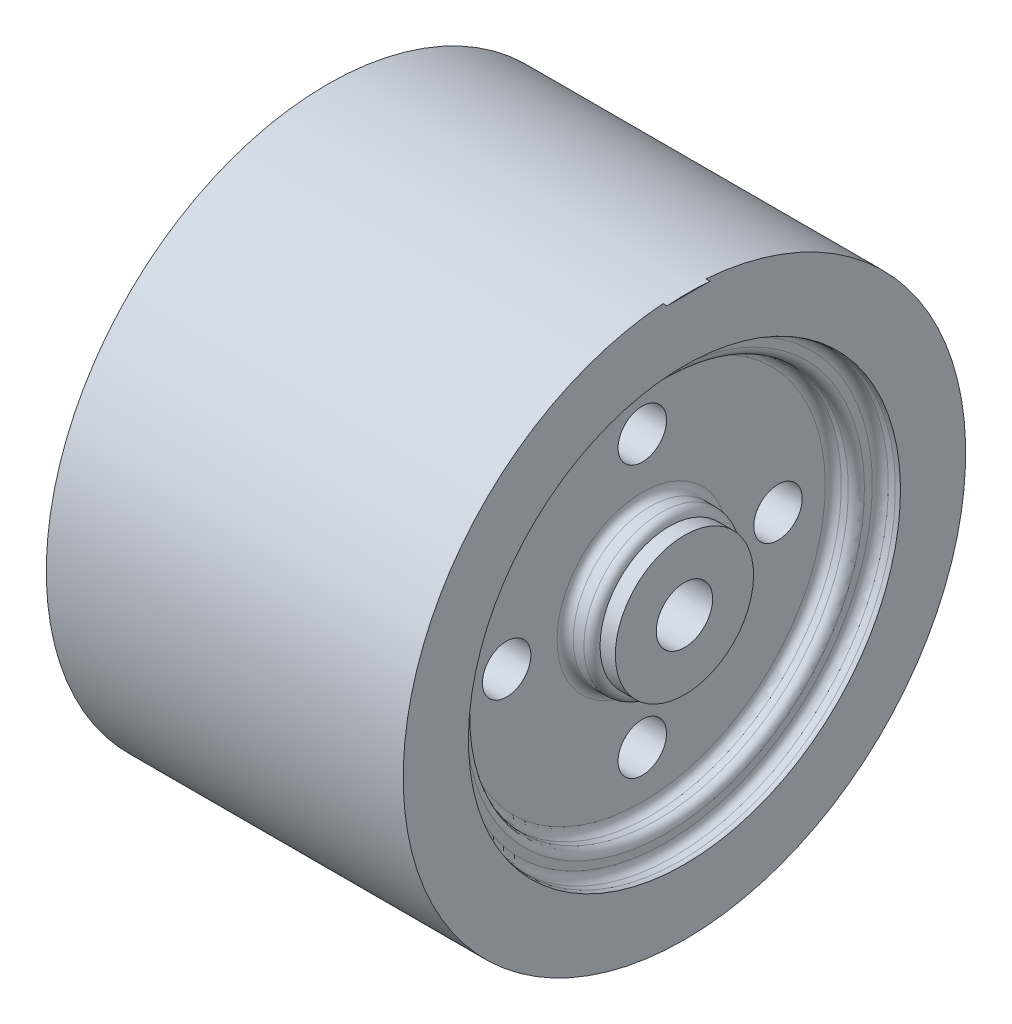
ISO-10303-21;
HEADER;
FILE_DESCRIPTION(('STEP AP214'),'2;1');
FILE_NAME('part.step','',(''),(''),'','','');
FILE_SCHEMA(('AUTOMOTIVE_DESIGN { 1 0 10303 214 1 1 1 1 }'));
ENDSEC;
DATA;
#1=APPLICATION_CONTEXT('core data for automotive mechanical design processes');
#2=APPLICATION_PROTOCOL_DEFINITION('international standard','automotive_design',2000,#1);
#3=PRODUCT_CONTEXT('',#1,'mechanical');
#4=PRODUCT('Part','Part','',(#3));
#5=PRODUCT_RELATED_PRODUCT_CATEGORY('part','',(#4));
#6=PRODUCT_DEFINITION_FORMATION('','',#4);
#7=PRODUCT_DEFINITION_CONTEXT('part definition',#1,'design');
#8=PRODUCT_DEFINITION('design','',#6,#7);
#9=PRODUCT_DEFINITION_SHAPE('','',#8);
#10=(LENGTH_UNIT() NAMED_UNIT(*) SI_UNIT(.MILLI.,.METRE.));
#11=(NAMED_UNIT(*) PLANE_ANGLE_UNIT() SI_UNIT($,.RADIAN.));
#12=(NAMED_UNIT(*) SI_UNIT($,.STERADIAN.) SOLID_ANGLE_UNIT());
#13=UNCERTAINTY_MEASURE_WITH_UNIT(LENGTH_MEASURE(1.E-05),#10,'distance_accuracy_value','');
#14=(GEOMETRIC_REPRESENTATION_CONTEXT(3) GLOBAL_UNCERTAINTY_ASSIGNED_CONTEXT((#13)) GLOBAL_UNIT_ASSIGNED_CONTEXT((#10,
#11,#12)) REPRESENTATION_CONTEXT('',''));
#15=CARTESIAN_POINT('',(0.,0.,0.));
#16=DIRECTION('',(0.,0.,1.));
#17=DIRECTION('',(1.,0.,0.));
#18=AXIS2_PLACEMENT_3D('',#15,#16,#17);
#19=CARTESIAN_POINT('',(24.,34.0850434994007,0.));
#20=DIRECTION('',(-1.,0.,0.));
#21=DIRECTION('',(0.,-1.,0.));
#22=AXIS2_PLACEMENT_3D('',#19,#20,#21);
#23=CYLINDRICAL_SURFACE('',#22,8.57905084931098);
#24=CARTESIAN_POINT('',(-20.,34.0850434994007,0.));
#25=DIRECTION('',(-1.,0.,0.));
#26=DIRECTION('',(0.,-1.,0.));
#27=AXIS2_PLACEMENT_3D('',#24,#25,#26);
#28=CIRCLE('',#27,8.57905084931098);
#29=CARTESIAN_POINT('',(-20.,25.5059926500898,0.));
#30=VERTEX_POINT('',#29);
#31=EDGE_CURVE('E43',#30,#30,#28,.T.);
#32=ORIENTED_EDGE('',*,*,#31,.T.);
#33=EDGE_LOOP('',(#32));
#34=FACE_BOUND('',#33,.T.);
#35=CARTESIAN_POINT('',(-22.,34.0850434994007,0.));
#36=DIRECTION('',(1.,0.,0.));
#37=DIRECTION('',(0.,1.,0.));
#38=AXIS2_PLACEMENT_3D('',#35,#36,#37);
#39=CIRCLE('',#38,8.57905084931098);
#40=CARTESIAN_POINT('',(-22.,42.6640943487117,0.));
#41=VERTEX_POINT('',#40);
#42=EDGE_CURVE('E11',#41,#41,#39,.T.);
#43=ORIENTED_EDGE('',*,*,#42,.T.);
#44=EDGE_LOOP('',(#43));
#45=FACE_BOUND('',#44,.T.);
#46=ADVANCED_FACE('F34',(#34,#45),#23,.T.);
#47=CARTESIAN_POINT('',(20.,34.0850434994007,0.));
#48=DIRECTION('',(1.,0.,0.));
#49=DIRECTION('',(0.,1.,0.));
#50=AXIS2_PLACEMENT_3D('',#47,#48,#49);
#51=CIRCLE('',#50,8.57905084931098);
#52=CARTESIAN_POINT('',(20.,42.6640943487117,0.));
#53=VERTEX_POINT('',#52);
#54=EDGE_CURVE('E503',#53,#53,#51,.F.);
#55=ORIENTED_EDGE('',*,*,#54,.F.);
#56=EDGE_LOOP('',(#55));
#57=FACE_BOUND('',#56,.T.);
#58=CARTESIAN_POINT('',(21.9,34.0850434994007,0.));
#59=DIRECTION('',(1.,0.,0.));
#60=DIRECTION('',(0.,1.,0.));
#61=AXIS2_PLACEMENT_3D('',#58,#59,#60);
#62=CIRCLE('',#61,8.57905084931098);
#63=CARTESIAN_POINT('',(21.9,42.6640943487117,0.));
#64=VERTEX_POINT('',#63);
#65=EDGE_CURVE('E74',#64,#64,#62,.T.);
#66=ORIENTED_EDGE('',*,*,#65,.F.);
#67=EDGE_LOOP('',(#66));
#68=FACE_BOUND('',#67,.T.);
#69=ADVANCED_FACE('F139',(#57,#68),#23,.T.);
#70=CARTESIAN_POINT('',(-45.3449936196497,34.0850434994007,0.));
#71=DIRECTION('',(-1.,0.,0.));
#72=DIRECTION('',(0.,-1.,0.));
#73=AXIS2_PLACEMENT_3D('',#70,#71,#72);
#74=CYLINDRICAL_SURFACE('',#73,3.50000000000001);
#75=CARTESIAN_POINT('',(-22.,34.0850434994007,0.));
#76=DIRECTION('',(1.,0.,0.));
#77=DIRECTION('',(0.,1.,0.));
#78=AXIS2_PLACEMENT_3D('',#75,#76,#77);
#79=CIRCLE('',#78,3.50000000000001);
#80=CARTESIAN_POINT('',(-22.,37.5850434994007,0.));
#81=VERTEX_POINT('',#80);
#82=EDGE_CURVE('E500',#81,#81,#79,.T.);
#83=ORIENTED_EDGE('',*,*,#82,.F.);
#84=EDGE_LOOP('',(#83));
#85=FACE_BOUND('',#84,.T.);
#86=CARTESIAN_POINT('',(21.9,34.0850434994007,0.));
#87=DIRECTION('',(1.,0.,0.));
#88=DIRECTION('',(0.,1.,0.));
#89=AXIS2_PLACEMENT_3D('',#86,#87,#88);
#90=CIRCLE('',#89,3.50000000000001);
#91=CARTESIAN_POINT('',(21.9,37.5850434994008,0.));
#92=VERTEX_POINT('',#91);
#93=EDGE_CURVE('E491',#92,#92,#90,.T.);
#94=ORIENTED_EDGE('',*,*,#93,.T.);
#95=EDGE_LOOP('',(#94));
#96=FACE_BOUND('',#95,.T.);
#97=ADVANCED_FACE('F135',(#85,#96),#74,.F.);
#98=CARTESIAN_POINT('',(21.4,34.0850434994007,0.));
#99=DIRECTION('',(-1.,0.,0.));
#100=DIRECTION('',(0.,-1.,0.));
#101=AXIS2_PLACEMENT_3D('',#98,#99,#100);
#102=TOROIDAL_SURFACE('',#101,27.6818695266668,1.);
#103=CARTESIAN_POINT('',(21.4,34.0850434994007,0.));
#104=DIRECTION('',(-1.,0.,0.));
#105=DIRECTION('',(0.,-1.,0.));
#106=AXIS2_PLACEMENT_3D('',#103,#104,#105);
#107=CIRCLE('',#106,26.6818695266668);
#108=CARTESIAN_POINT('',(21.4,7.40317397273399,0.));
#109=VERTEX_POINT('',#108);
#110=EDGE_CURVE('E78',#109,#109,#107,.T.);
#111=ORIENTED_EDGE('',*,*,#110,.T.);
#112=EDGE_LOOP('',(#111));
#113=FACE_BOUND('',#112,.T.);
#114=CARTESIAN_POINT('',(21.9,34.0850434994007,0.));
#115=DIRECTION('',(-1.,0.,0.));
#116=DIRECTION('',(0.,-1.,0.));
#117=AXIS2_PLACEMENT_3D('',#114,#115,#116);
#118=CIRCLE('',#117,26.8158441228823);
#119=CARTESIAN_POINT('',(21.9,7.26919937651843,0.));
#120=VERTEX_POINT('',#119);
#121=EDGE_CURVE('E38',#120,#120,#118,.F.);
#122=ORIENTED_EDGE('',*,*,#121,.T.);
#123=EDGE_LOOP('',(#122));
#124=FACE_BOUND('',#123,.T.);
#125=ADVANCED_FACE('F127',(#113,#124),#102,.T.);
#126=CARTESIAN_POINT('',(-19.,34.0850434994007,0.));
#127=DIRECTION('',(-1.,0.,0.));
#128=DIRECTION('',(0.,-1.,0.));
#129=AXIS2_PLACEMENT_3D('',#126,#127,#128);
#130=TOROIDAL_SURFACE('',#129,8.57905084931098,0.999999999999997);
#131=CARTESIAN_POINT('',(-19.,34.0850434994007,0.));
#132=DIRECTION('',(-1.,0.,0.));
#133=DIRECTION('',(0.,-1.,0.));
#134=AXIS2_PLACEMENT_3D('',#131,#132,#133);
#135=CIRCLE('',#134,9.57905084931097);
#136=CARTESIAN_POINT('',(-19.,24.5059926500898,0.));
#137=VERTEX_POINT('',#136);
#138=EDGE_CURVE('E117',#137,#137,#135,.T.);
#139=ORIENTED_EDGE('',*,*,#138,.T.);
#140=EDGE_LOOP('',(#139));
#141=FACE_BOUND('',#140,.T.);
#142=ORIENTED_EDGE('',*,*,#31,.F.);
#143=EDGE_LOOP('',(#142));
#144=FACE_BOUND('',#143,.T.);
#145=ADVANCED_FACE('F36',(#141,#144),#130,.T.);
#146=CARTESIAN_POINT('',(-45.3449936196497,34.0850434994007,0.));
#147=DIRECTION('',(-1.,0.,0.));
#148=DIRECTION('',(0.,-1.,0.));
#149=AXIS2_PLACEMENT_3D('',#146,#147,#148);
#150=CYLINDRICAL_SURFACE('',#149,9.57905084931097);
#151=CARTESIAN_POINT('',(-17.6686422910207,34.0850434994007,0.));
#152=DIRECTION('',(-1.,0.,0.));
#153=DIRECTION('',(0.,-1.,0.));
#154=AXIS2_PLACEMENT_3D('',#151,#152,#153);
#155=CIRCLE('',#154,9.57905084931097);
#156=CARTESIAN_POINT('',(-17.6686422910207,24.5059926500898,0.));
#157=VERTEX_POINT('',#156);
#158=EDGE_CURVE('E114',#157,#157,#155,.T.);
#159=ORIENTED_EDGE('',*,*,#158,.T.);
#160=EDGE_LOOP('',(#159));
#161=FACE_BOUND('',#160,.T.);
#162=ORIENTED_EDGE('',*,*,#138,.F.);
#163=EDGE_LOOP('',(#162));
#164=FACE_BOUND('',#163,.T.);
#165=ADVANCED_FACE('F126',(#161,#164),#150,.T.);
#166=CARTESIAN_POINT('',(-17.6686422910207,34.0850434994007,0.));
#167=DIRECTION('',(-1.,0.,0.));
#168=DIRECTION('',(0.,-1.,0.));
#169=AXIS2_PLACEMENT_3D('',#166,#167,#168);
#170=TOROIDAL_SURFACE('',#169,10.579050849311,1.);
#171=CARTESIAN_POINT('',(-16.6686422910207,34.0850434994007,0.));
#172=DIRECTION('',(-1.,0.,0.));
#173=DIRECTION('',(0.,-1.,0.));
#174=AXIS2_PLACEMENT_3D('',#171,#172,#173);
#175=CIRCLE('',#174,10.579050849311);
#176=CARTESIAN_POINT('',(-16.6686422910207,23.5059926500898,0.));
#177=VERTEX_POINT('',#176);
#178=EDGE_CURVE('E111',#177,#177,#175,.T.);
#179=ORIENTED_EDGE('',*,*,#178,.T.);
#180=EDGE_LOOP('',(#179));
#181=FACE_BOUND('',#180,.T.);
#182=ORIENTED_EDGE('',*,*,#158,.F.);
#183=EDGE_LOOP('',(#182));
#184=FACE_BOUND('',#183,.T.);
#185=ADVANCED_FACE('F133',(#181,#184),#170,.F.);
#186=CARTESIAN_POINT('',(-16.6686422910207,23.5059926500898,0.));
#187=DIRECTION('',(-1.,0.,0.));
#188=DIRECTION('',(0.,-1.,0.));
#189=AXIS2_PLACEMENT_3D('',#186,#187,#188);
#190=PLANE('',#189);
#191=CARTESIAN_POINT('',(-16.6686422910207,50.9244513745696,0.));
#192=DIRECTION('',(-1.,0.,0.));
#193=DIRECTION('',(0.,-1.,0.));
#194=AXIS2_PLACEMENT_3D('',#191,#192,#193);
#195=CIRCLE('',#194,3.00725892953214);
#196=CARTESIAN_POINT('',(-16.6686422910207,47.9171924450375,0.));
#197=VERTEX_POINT('',#196);
#198=EDGE_CURVE('E527',#197,#197,#195,.T.);
#199=ORIENTED_EDGE('',*,*,#198,.F.);
#200=EDGE_LOOP('',(#199));
#201=FACE_BOUND('',#200,.T.);
#202=CARTESIAN_POINT('',(-16.6686422910207,34.0850434994009,-16.8394078751691));
#203=DIRECTION('',(-1.,0.,0.));
#204=DIRECTION('',(0.,-1.,0.));
#205=AXIS2_PLACEMENT_3D('',#202,#203,#204);
#206=CIRCLE('',#205,3.00725892953214);
#207=CARTESIAN_POINT('',(-16.6686422910207,31.0777845698688,-16.8394078751691));
#208=VERTEX_POINT('',#207);
#209=EDGE_CURVE('E524',#208,#208,#206,.T.);
#210=ORIENTED_EDGE('',*,*,#209,.F.);
#211=EDGE_LOOP('',(#210));
#212=FACE_BOUND('',#211,.T.);
#213=CARTESIAN_POINT('',(-16.6686422910207,17.2456356242319,-3.52766870119921E-13));
#214=DIRECTION('',(-1.,0.,0.));
#215=DIRECTION('',(0.,-1.,0.));
#216=AXIS2_PLACEMENT_3D('',#213,#214,#215);
#217=CIRCLE('',#216,3.00725892953214);
#218=CARTESIAN_POINT('',(-16.6686422910207,14.2383766946997,-3.52766870119921E-13));
#219=VERTEX_POINT('',#218);
#220=EDGE_CURVE('E521',#219,#219,#217,.T.);
#221=ORIENTED_EDGE('',*,*,#220,.F.);
#222=EDGE_LOOP('',(#221));
#223=FACE_BOUND('',#222,.T.);
#224=CARTESIAN_POINT('',(-16.6686422910207,34.0850434994007,16.8394078751686));
#225=DIRECTION('',(-1.,0.,0.));
#226=DIRECTION('',(0.,-1.,0.));
#227=AXIS2_PLACEMENT_3D('',#224,#225,#226);
#228=CIRCLE('',#227,3.00725892953214);
#229=CARTESIAN_POINT('',(-16.6686422910207,31.0777845698685,16.8394078751686));
#230=VERTEX_POINT('',#229);
#231=EDGE_CURVE('E510',#230,#230,#228,.T.);
#232=ORIENTED_EDGE('',*,*,#231,.F.);
#233=EDGE_LOOP('',(#232));
#234=FACE_BOUND('',#233,.T.);
#235=CARTESIAN_POINT('',(-16.6686422910207,34.0850434994007,0.));
#236=DIRECTION('',(-1.,0.,0.));
#237=DIRECTION('',(0.,-1.,0.));
#238=AXIS2_PLACEMENT_3D('',#235,#236,#237);
#239=CIRCLE('',#238,22.7098120973116);
#240=CARTESIAN_POINT('',(-16.6686422910207,11.3752314020891,0.));
#241=VERTEX_POINT('',#240);
#242=EDGE_CURVE('E108',#241,#241,#239,.T.);
#243=ORIENTED_EDGE('',*,*,#242,.T.);
#244=EDGE_LOOP('',(#243));
#245=FACE_BOUND('',#244,.T.);
#246=ORIENTED_EDGE('',*,*,#178,.F.);
#247=EDGE_LOOP('',(#246));
#248=FACE_BOUND('',#247,.T.);
#249=ADVANCED_FACE('F243',(#201,#212,#223,#234,#245,#248),#190,.T.);
#250=CARTESIAN_POINT('',(-17.6686422910207,34.0850434994007,0.));
#251=DIRECTION('',(-1.,0.,0.));
#252=DIRECTION('',(0.,-1.,0.));
#253=AXIS2_PLACEMENT_3D('',#250,#251,#252);
#254=TOROIDAL_SURFACE('',#253,22.7098120973116,0.999999999999996);
#255=CARTESIAN_POINT('',(-17.6686422910207,34.0850434994007,0.));
#256=DIRECTION('',(-1.,0.,0.));
#257=DIRECTION('',(0.,-1.,0.));
#258=AXIS2_PLACEMENT_3D('',#255,#256,#257);
#259=CIRCLE('',#258,23.7098120973116);
#260=CARTESIAN_POINT('',(-17.6686422910207,10.3752314020891,0.));
#261=VERTEX_POINT('',#260);
#262=EDGE_CURVE('E105',#261,#261,#259,.T.);
#263=ORIENTED_EDGE('',*,*,#262,.T.);
#264=EDGE_LOOP('',(#263));
#265=FACE_BOUND('',#264,.T.);
#266=ORIENTED_EDGE('',*,*,#242,.F.);
#267=EDGE_LOOP('',(#266));
#268=FACE_BOUND('',#267,.T.);
#269=ADVANCED_FACE('F239',(#265,#268),#254,.F.);
#270=CARTESIAN_POINT('',(-45.3449936196497,34.0850434994007,0.));
#271=DIRECTION('',(-1.,0.,0.));
#272=DIRECTION('',(0.,-1.,0.));
#273=AXIS2_PLACEMENT_3D('',#270,#271,#272);
#274=CYLINDRICAL_SURFACE('',#273,23.7098120973116);
#275=CARTESIAN_POINT('',(-18.5343211455104,34.0850434994007,0.));
#276=DIRECTION('',(-1.,0.,0.));
#277=DIRECTION('',(0.,-1.,0.));
#278=AXIS2_PLACEMENT_3D('',#275,#276,#277);
#279=CIRCLE('',#278,23.7098120973116);
#280=CARTESIAN_POINT('',(-18.5343211455103,10.3752314020891,0.));
#281=VERTEX_POINT('',#280);
#282=EDGE_CURVE('E102',#281,#281,#279,.T.);
#283=ORIENTED_EDGE('',*,*,#282,.T.);
#284=EDGE_LOOP('',(#283));
#285=FACE_BOUND('',#284,.T.);
#286=ORIENTED_EDGE('',*,*,#262,.F.);
#287=EDGE_LOOP('',(#286));
#288=FACE_BOUND('',#287,.T.);
#289=ADVANCED_FACE('F235',(#285,#288),#274,.F.);
#290=CARTESIAN_POINT('',(-18.5343211455104,34.0850434994007,0.));
#291=DIRECTION('',(-1.,0.,0.));
#292=DIRECTION('',(0.,-1.,0.));
#293=AXIS2_PLACEMENT_3D('',#290,#291,#292);
#294=TOROIDAL_SURFACE('',#293,24.7098120973116,1.);
#295=CARTESIAN_POINT('',(-19.5343211455104,34.0850434994007,0.));
#296=DIRECTION('',(-1.,0.,0.));
#297=DIRECTION('',(0.,-1.,0.));
#298=AXIS2_PLACEMENT_3D('',#295,#296,#297);
#299=CIRCLE('',#298,24.7098120973116);
#300=CARTESIAN_POINT('',(-19.5343211455103,9.37523140208914,0.));
#301=VERTEX_POINT('',#300);
#302=EDGE_CURVE('E99',#301,#301,#299,.T.);
#303=ORIENTED_EDGE('',*,*,#302,.T.);
#304=EDGE_LOOP('',(#303));
#305=FACE_BOUND('',#304,.T.);
#306=ORIENTED_EDGE('',*,*,#282,.F.);
#307=EDGE_LOOP('',(#306));
#308=FACE_BOUND('',#307,.T.);
#309=ADVANCED_FACE('F231',(#305,#308),#294,.T.);
#310=CARTESIAN_POINT('',(-19.5343211455103,8.40317397273399,0.));
#311=DIRECTION('',(-1.,0.,0.));
#312=DIRECTION('',(0.,-1.,0.));
#313=AXIS2_PLACEMENT_3D('',#310,#311,#312);
#314=PLANE('',#313);
#315=CARTESIAN_POINT('',(-19.5343211455104,34.0850434994007,0.));
#316=DIRECTION('',(-1.,0.,0.));
#317=DIRECTION('',(0.,-1.,0.));
#318=AXIS2_PLACEMENT_3D('',#315,#316,#317);
#319=CIRCLE('',#318,25.6818695266668);
#320=CARTESIAN_POINT('',(-19.5343211455103,8.40317397273399,0.));
#321=VERTEX_POINT('',#320);
#322=EDGE_CURVE('E96',#321,#321,#319,.T.);
#323=ORIENTED_EDGE('',*,*,#322,.T.);
#324=EDGE_LOOP('',(#323));
#325=FACE_BOUND('',#324,.T.);
#326=ORIENTED_EDGE('',*,*,#302,.F.);
#327=EDGE_LOOP('',(#326));
#328=FACE_BOUND('',#327,.T.);
#329=ADVANCED_FACE('F227',(#325,#328),#314,.T.);
#330=CARTESIAN_POINT('',(-20.5343211455104,34.0850434994007,0.));
#331=DIRECTION('',(-1.,0.,0.));
#332=DIRECTION('',(0.,-1.,0.));
#333=AXIS2_PLACEMENT_3D('',#330,#331,#332);
#334=TOROIDAL_SURFACE('',#333,25.6818695266668,1.);
#335=CARTESIAN_POINT('',(-20.5343211455104,34.0850434994007,0.));
#336=DIRECTION('',(-1.,0.,0.));
#337=DIRECTION('',(0.,-1.,0.));
#338=AXIS2_PLACEMENT_3D('',#335,#336,#337);
#339=CIRCLE('',#338,26.6818695266668);
#340=CARTESIAN_POINT('',(-20.5343211455103,7.40317397273399,0.));
#341=VERTEX_POINT('',#340);
#342=EDGE_CURVE('E93',#341,#341,#339,.T.);
#343=ORIENTED_EDGE('',*,*,#342,.T.);
#344=EDGE_LOOP('',(#343));
#345=FACE_BOUND('',#344,.T.);
#346=ORIENTED_EDGE('',*,*,#322,.F.);
#347=EDGE_LOOP('',(#346));
#348=FACE_BOUND('',#347,.T.);
#349=ADVANCED_FACE('F223',(#345,#348),#334,.F.);
#350=CARTESIAN_POINT('',(-45.3449936196497,34.0850434994007,0.));
#351=DIRECTION('',(-1.,0.,0.));
#352=DIRECTION('',(0.,-1.,0.));
#353=AXIS2_PLACEMENT_3D('',#350,#351,#352);
#354=CYLINDRICAL_SURFACE('',#353,26.6818695266667);
#355=CARTESIAN_POINT('',(-21.4,34.0850434994007,0.));
#356=DIRECTION('',(-1.,0.,0.));
#357=DIRECTION('',(0.,-1.,0.));
#358=AXIS2_PLACEMENT_3D('',#355,#356,#357);
#359=CIRCLE('',#358,26.6818695266667);
#360=CARTESIAN_POINT('',(-21.4,7.40317397273399,0.));
#361=VERTEX_POINT('',#360);
#362=EDGE_CURVE('E90',#361,#361,#359,.T.);
#363=ORIENTED_EDGE('',*,*,#362,.T.);
#364=EDGE_LOOP('',(#363));
#365=FACE_BOUND('',#364,.T.);
#366=ORIENTED_EDGE('',*,*,#342,.F.);
#367=EDGE_LOOP('',(#366));
#368=FACE_BOUND('',#367,.T.);
#369=ADVANCED_FACE('F219',(#365,#368),#354,.F.);
#370=CARTESIAN_POINT('',(-21.4,34.0850434994007,0.));
#371=DIRECTION('',(-1.,0.,0.));
#372=DIRECTION('',(0.,-1.,0.));
#373=AXIS2_PLACEMENT_3D('',#370,#371,#372);
#374=TOROIDAL_SURFACE('',#373,27.6818695266667,1.);
#375=CARTESIAN_POINT('',(-22.4,34.0850434994007,0.));
#376=DIRECTION('',(-1.,0.,0.));
#377=DIRECTION('',(0.,-1.,0.));
#378=AXIS2_PLACEMENT_3D('',#375,#376,#377);
#379=CIRCLE('',#378,27.6818695266667);
#380=CARTESIAN_POINT('',(-22.4,6.40317397273399,0.));
#381=VERTEX_POINT('',#380);
#382=EDGE_CURVE('E81',#381,#381,#379,.T.);
#383=ORIENTED_EDGE('',*,*,#382,.T.);
#384=EDGE_LOOP('',(#383));
#385=FACE_BOUND('',#384,.T.);
#386=ORIENTED_EDGE('',*,*,#362,.F.);
#387=EDGE_LOOP('',(#386));
#388=FACE_BOUND('',#387,.T.);
#389=ADVANCED_FACE('F215',(#385,#388),#374,.T.);
#390=CARTESIAN_POINT('',(-22.4,6.40317397273399,0.));
#391=DIRECTION('',(-1.,0.,0.));
#392=DIRECTION('',(0.,-1.,0.));
#393=AXIS2_PLACEMENT_3D('',#390,#391,#392);
#394=PLANE('',#393);
#395=CARTESIAN_POINT('',(-22.4,34.0850434994007,0.));
#396=DIRECTION('',(-1.,0.,0.));
#397=DIRECTION('',(0.,-1.,0.));
#398=AXIS2_PLACEMENT_3D('',#395,#396,#397);
#399=CIRCLE('',#398,34.9074128176976);
#400=CARTESIAN_POINT('',(-22.4,-0.822369318296837,0.));
#401=VERTEX_POINT('',#400);
#402=EDGE_CURVE('E77',#401,#401,#399,.T.);
#403=ORIENTED_EDGE('',*,*,#402,.T.);
#404=EDGE_LOOP('',(#403));
#405=FACE_BOUND('',#404,.T.);
#406=ORIENTED_EDGE('',*,*,#382,.F.);
#407=EDGE_LOOP('',(#406));
#408=FACE_BOUND('',#407,.T.);
#409=ADVANCED_FACE('F212',(#405,#408),#394,.T.);
#410=CARTESIAN_POINT('',(-45.3449936196497,34.0850434994007,0.));
#411=DIRECTION('',(-1.,0.,0.));
#412=DIRECTION('',(0.,-1.,0.));
#413=AXIS2_PLACEMENT_3D('',#410,#411,#412);
#414=CYLINDRICAL_SURFACE('',#413,34.9074128176976);
#415=DIRECTION('',(-1.,0.,0.));
#416=VECTOR('',#415,1.);
#417=CARTESIAN_POINT('',(-45.3449936196498,68.8917860292091,-2.64917800247341));
#418=LINE('',#417,#416);
#419=CARTESIAN_POINT('',(21.9,68.8917860292091,-2.64917800247349));
#420=VERTEX_POINT('',#419);
#421=CARTESIAN_POINT('',(22.4,68.8917860292091,-2.64917800247341));
#422=VERTEX_POINT('',#421);
#423=EDGE_CURVE('E50',#420,#422,#418,.F.);
#424=ORIENTED_EDGE('',*,*,#423,.F.);
#425=CARTESIAN_POINT('',(21.9,34.0850434994007,0.));
#426=DIRECTION('',(1.,0.,0.));
#427=DIRECTION('',(0.,1.,0.));
#428=AXIS2_PLACEMENT_3D('',#425,#426,#427);
#429=CIRCLE('',#428,34.9074128176976);
#430=CARTESIAN_POINT('',(21.9,68.8917860292091,2.64917800247349));
#431=VERTEX_POINT('',#430);
#432=EDGE_CURVE('E73',#420,#431,#429,.F.);
#433=ORIENTED_EDGE('',*,*,#432,.T.);
#434=DIRECTION('',(-1.,0.,0.));
#435=VECTOR('',#434,1.);
#436=CARTESIAN_POINT('',(-45.3449936196498,68.8917860292091,2.64917800247341));
#437=LINE('',#436,#435);
#438=CARTESIAN_POINT('',(22.4,68.8917860292091,2.64917800247342));
#439=VERTEX_POINT('',#438);
#440=EDGE_CURVE('E55',#439,#431,#437,.T.);
#441=ORIENTED_EDGE('',*,*,#440,.F.);
#442=CARTESIAN_POINT('',(22.4,34.0850434994007,0.));
#443=DIRECTION('',(-1.,0.,0.));
#444=DIRECTION('',(0.,-1.,0.));
#445=AXIS2_PLACEMENT_3D('',#442,#443,#444);
#446=CIRCLE('',#445,34.9074128176976);
#447=EDGE_CURVE('E72',#439,#422,#446,.T.);
#448=ORIENTED_EDGE('',*,*,#447,.T.);
#449=EDGE_LOOP('',(#424,#433,#441,#448));
#450=FACE_BOUND('',#449,.T.);
#451=ORIENTED_EDGE('',*,*,#402,.F.);
#452=EDGE_LOOP('',(#451));
#453=FACE_BOUND('',#452,.T.);
#454=ADVANCED_FACE('F70',(#450,#453),#414,.T.);
#455=CARTESIAN_POINT('',(22.4,-0.822369318296831,0.));
#456=DIRECTION('',(1.,0.,0.));
#457=DIRECTION('',(0.,1.,0.));
#458=AXIS2_PLACEMENT_3D('',#455,#456,#457);
#459=PLANE('',#458);
#460=DIRECTION('',(0.,0.,1.));
#461=VECTOR('',#460,1.);
#462=CARTESIAN_POINT('',(22.4,68.8917860292091,46.8308899491964));
#463=LINE('',#462,#461);
#464=EDGE_CURVE('E61',#422,#439,#463,.T.);
#465=ORIENTED_EDGE('',*,*,#464,.F.);
#466=ORIENTED_EDGE('',*,*,#447,.F.);
#467=EDGE_LOOP('',(#465,#466));
#468=FACE_BOUND('',#467,.T.);
#469=ADVANCED_FACE('F76',(#468),#459,.T.);
#470=CARTESIAN_POINT('',(-45.3449936196497,34.0850434994007,0.));
#471=DIRECTION('',(-1.,0.,0.));
#472=DIRECTION('',(0.,-1.,0.));
#473=AXIS2_PLACEMENT_3D('',#470,#471,#472);
#474=CYLINDRICAL_SURFACE('',#473,26.6818695266668);
#475=CARTESIAN_POINT('',(20.5343211455104,34.0850434994007,0.));
#476=DIRECTION('',(-1.,0.,0.));
#477=DIRECTION('',(0.,-1.,0.));
#478=AXIS2_PLACEMENT_3D('',#475,#476,#477);
#479=CIRCLE('',#478,26.6818695266668);
#480=CARTESIAN_POINT('',(20.5343211455104,7.40317397273399,0.));
#481=VERTEX_POINT('',#480);
#482=EDGE_CURVE('E84',#481,#481,#479,.T.);
#483=ORIENTED_EDGE('',*,*,#482,.T.);
#484=EDGE_LOOP('',(#483));
#485=FACE_BOUND('',#484,.T.);
#486=ORIENTED_EDGE('',*,*,#110,.F.);
#487=EDGE_LOOP('',(#486));
#488=FACE_BOUND('',#487,.T.);
#489=ADVANCED_FACE('F203',(#485,#488),#474,.F.);
#490=CARTESIAN_POINT('',(20.5343211455104,34.0850434994007,0.));
#491=DIRECTION('',(-1.,0.,0.));
#492=DIRECTION('',(0.,-1.,0.));
#493=AXIS2_PLACEMENT_3D('',#490,#491,#492);
#494=TOROIDAL_SURFACE('',#493,25.6818695266668,1.);
#495=CARTESIAN_POINT('',(19.5343211455103,34.0850434994007,0.));
#496=DIRECTION('',(-1.,0.,0.));
#497=DIRECTION('',(0.,-1.,0.));
#498=AXIS2_PLACEMENT_3D('',#495,#496,#497);
#499=CIRCLE('',#498,25.6818695266668);
#500=CARTESIAN_POINT('',(19.5343211455104,8.40317397273399,0.));
#501=VERTEX_POINT('',#500);
#502=EDGE_CURVE('E551',#501,#501,#499,.T.);
#503=ORIENTED_EDGE('',*,*,#502,.T.);
#504=EDGE_LOOP('',(#503));
#505=FACE_BOUND('',#504,.T.);
#506=ORIENTED_EDGE('',*,*,#482,.F.);
#507=EDGE_LOOP('',(#506));
#508=FACE_BOUND('',#507,.T.);
#509=ADVANCED_FACE('F199',(#505,#508),#494,.F.);
#510=CARTESIAN_POINT('',(19.5343211455104,8.40317397273399,0.));
#511=DIRECTION('',(1.,0.,0.));
#512=DIRECTION('',(0.,1.,0.));
#513=AXIS2_PLACEMENT_3D('',#510,#511,#512);
#514=PLANE('',#513);
#515=CARTESIAN_POINT('',(19.5343211455104,34.0850434994007,0.));
#516=DIRECTION('',(-1.,0.,0.));
#517=DIRECTION('',(0.,-1.,0.));
#518=AXIS2_PLACEMENT_3D('',#515,#516,#517);
#519=CIRCLE('',#518,24.7098120973116);
#520=CARTESIAN_POINT('',(19.5343211455104,9.37523140208915,0.));
#521=VERTEX_POINT('',#520);
#522=EDGE_CURVE('E548',#521,#521,#519,.T.);
#523=ORIENTED_EDGE('',*,*,#522,.T.);
#524=EDGE_LOOP('',(#523));
#525=FACE_BOUND('',#524,.T.);
#526=ORIENTED_EDGE('',*,*,#502,.F.);
#527=EDGE_LOOP('',(#526));
#528=FACE_BOUND('',#527,.T.);
#529=ADVANCED_FACE('F195',(#525,#528),#514,.T.);
#530=CARTESIAN_POINT('',(18.5343211455104,34.0850434994007,0.));
#531=DIRECTION('',(-1.,0.,0.));
#532=DIRECTION('',(0.,-1.,0.));
#533=AXIS2_PLACEMENT_3D('',#530,#531,#532);
#534=TOROIDAL_SURFACE('',#533,24.7098120973116,1.);
#535=CARTESIAN_POINT('',(18.5343211455104,34.0850434994007,0.));
#536=DIRECTION('',(-1.,0.,0.));
#537=DIRECTION('',(0.,-1.,0.));
#538=AXIS2_PLACEMENT_3D('',#535,#536,#537);
#539=CIRCLE('',#538,23.7098120973116);
#540=CARTESIAN_POINT('',(18.5343211455104,10.3752314020891,0.));
#541=VERTEX_POINT('',#540);
#542=EDGE_CURVE('E545',#541,#541,#539,.T.);
#543=ORIENTED_EDGE('',*,*,#542,.T.);
#544=EDGE_LOOP('',(#543));
#545=FACE_BOUND('',#544,.T.);
#546=ORIENTED_EDGE('',*,*,#522,.F.);
#547=EDGE_LOOP('',(#546));
#548=FACE_BOUND('',#547,.T.);
#549=ADVANCED_FACE('F191',(#545,#548),#534,.T.);
#550=CARTESIAN_POINT('',(-45.3449936196497,34.0850434994007,0.));
#551=DIRECTION('',(-1.,0.,0.));
#552=DIRECTION('',(0.,-1.,0.));
#553=AXIS2_PLACEMENT_3D('',#550,#551,#552);
#554=CYLINDRICAL_SURFACE('',#553,23.7098120973116);
#555=CARTESIAN_POINT('',(17.6686422910207,34.0850434994007,0.));
#556=DIRECTION('',(-1.,0.,0.));
#557=DIRECTION('',(0.,-1.,0.));
#558=AXIS2_PLACEMENT_3D('',#555,#556,#557);
#559=CIRCLE('',#558,23.7098120973116);
#560=CARTESIAN_POINT('',(17.6686422910207,10.3752314020892,0.));
#561=VERTEX_POINT('',#560);
#562=EDGE_CURVE('E542',#561,#561,#559,.T.);
#563=ORIENTED_EDGE('',*,*,#562,.T.);
#564=EDGE_LOOP('',(#563));
#565=FACE_BOUND('',#564,.T.);
#566=ORIENTED_EDGE('',*,*,#542,.F.);
#567=EDGE_LOOP('',(#566));
#568=FACE_BOUND('',#567,.T.);
#569=ADVANCED_FACE('F187',(#565,#568),#554,.F.);
#570=CARTESIAN_POINT('',(17.6686422910207,34.0850434994007,0.));
#571=DIRECTION('',(-1.,0.,0.));
#572=DIRECTION('',(0.,-1.,0.));
#573=AXIS2_PLACEMENT_3D('',#570,#571,#572);
#574=TOROIDAL_SURFACE('',#573,22.7098120973116,0.999999999999996);
#575=CARTESIAN_POINT('',(16.6686422910207,34.0850434994007,0.));
#576=DIRECTION('',(-1.,0.,0.));
#577=DIRECTION('',(0.,-1.,0.));
#578=AXIS2_PLACEMENT_3D('',#575,#576,#577);
#579=CIRCLE('',#578,22.7098120973116);
#580=CARTESIAN_POINT('',(16.6686422910207,11.3752314020891,0.));
#581=VERTEX_POINT('',#580);
#582=EDGE_CURVE('E539',#581,#581,#579,.T.);
#583=ORIENTED_EDGE('',*,*,#582,.T.);
#584=EDGE_LOOP('',(#583));
#585=FACE_BOUND('',#584,.T.);
#586=ORIENTED_EDGE('',*,*,#562,.F.);
#587=EDGE_LOOP('',(#586));
#588=FACE_BOUND('',#587,.T.);
#589=ADVANCED_FACE('F183',(#585,#588),#574,.F.);
#590=CARTESIAN_POINT('',(16.6686422910207,23.5059926500898,0.));
#591=DIRECTION('',(1.,0.,0.));
#592=DIRECTION('',(0.,1.,0.));
#593=AXIS2_PLACEMENT_3D('',#590,#591,#592);
#594=PLANE('',#593);
#595=CARTESIAN_POINT('',(16.6686422910207,50.9244513745696,0.));
#596=DIRECTION('',(1.,0.,0.));
#597=DIRECTION('',(0.,1.,0.));
#598=AXIS2_PLACEMENT_3D('',#595,#596,#597);
#599=CIRCLE('',#598,3.00725892953214);
#600=CARTESIAN_POINT('',(16.6686422910207,53.9317103041017,0.));
#601=VERTEX_POINT('',#600);
#602=EDGE_CURVE('E507',#601,#601,#599,.T.);
#603=ORIENTED_EDGE('',*,*,#602,.F.);
#604=EDGE_LOOP('',(#603));
#605=FACE_BOUND('',#604,.T.);
#606=CARTESIAN_POINT('',(16.6686422910207,34.0850434994009,-16.8394078751691));
#607=DIRECTION('',(1.,0.,0.));
#608=DIRECTION('',(0.,1.,0.));
#609=AXIS2_PLACEMENT_3D('',#606,#607,#608);
#610=CIRCLE('',#609,3.00725892953214);
#611=CARTESIAN_POINT('',(16.6686422910207,37.0923024289331,-16.8394078751691));
#612=VERTEX_POINT('',#611);
#613=EDGE_CURVE('E511',#612,#612,#610,.T.);
#614=ORIENTED_EDGE('',*,*,#613,.F.);
#615=EDGE_LOOP('',(#614));
#616=FACE_BOUND('',#615,.T.);
#617=CARTESIAN_POINT('',(16.6686422910207,17.2456356242319,-3.52766870119921E-13));
#618=DIRECTION('',(1.,0.,0.));
#619=DIRECTION('',(0.,1.,0.));
#620=AXIS2_PLACEMENT_3D('',#617,#618,#619);
#621=CIRCLE('',#620,3.00725892953214);
#622=CARTESIAN_POINT('',(16.6686422910207,20.252894553764,-3.52766870119921E-13));
#623=VERTEX_POINT('',#622);
#624=EDGE_CURVE('E514',#623,#623,#621,.T.);
#625=ORIENTED_EDGE('',*,*,#624,.F.);
#626=EDGE_LOOP('',(#625));
#627=FACE_BOUND('',#626,.T.);
#628=CARTESIAN_POINT('',(16.6686422910207,34.0850434994007,16.8394078751686));
#629=DIRECTION('',(1.,0.,0.));
#630=DIRECTION('',(0.,1.,0.));
#631=AXIS2_PLACEMENT_3D('',#628,#629,#630);
#632=CIRCLE('',#631,3.00725892953214);
#633=CARTESIAN_POINT('',(16.6686422910207,37.0923024289328,16.8394078751686));
#634=VERTEX_POINT('',#633);
#635=EDGE_CURVE('E506',#634,#634,#632,.T.);
#636=ORIENTED_EDGE('',*,*,#635,.F.);
#637=EDGE_LOOP('',(#636));
#638=FACE_BOUND('',#637,.T.);
#639=CARTESIAN_POINT('',(16.6686422910207,34.0850434994007,0.));
#640=DIRECTION('',(-1.,0.,0.));
#641=DIRECTION('',(0.,-1.,0.));
#642=AXIS2_PLACEMENT_3D('',#639,#640,#641);
#643=CIRCLE('',#642,10.579050849311);
#644=CARTESIAN_POINT('',(16.6686422910207,23.5059926500898,0.));
#645=VERTEX_POINT('',#644);
#646=EDGE_CURVE('E536',#645,#645,#643,.T.);
#647=ORIENTED_EDGE('',*,*,#646,.T.);
#648=EDGE_LOOP('',(#647));
#649=FACE_BOUND('',#648,.T.);
#650=ORIENTED_EDGE('',*,*,#582,.F.);
#651=EDGE_LOOP('',(#650));
#652=FACE_BOUND('',#651,.T.);
#653=ADVANCED_FACE('F179',(#605,#616,#627,#638,#649,#652),#594,.T.);
#654=CARTESIAN_POINT('',(17.6686422910207,34.0850434994007,0.));
#655=DIRECTION('',(-1.,0.,0.));
#656=DIRECTION('',(0.,-1.,0.));
#657=AXIS2_PLACEMENT_3D('',#654,#655,#656);
#658=TOROIDAL_SURFACE('',#657,10.579050849311,1.);
#659=CARTESIAN_POINT('',(17.6686422910207,34.0850434994007,0.));
#660=DIRECTION('',(-1.,0.,0.));
#661=DIRECTION('',(0.,-1.,0.));
#662=AXIS2_PLACEMENT_3D('',#659,#660,#661);
#663=CIRCLE('',#662,9.57905084931098);
#664=CARTESIAN_POINT('',(17.6686422910207,24.5059926500898,0.));
#665=VERTEX_POINT('',#664);
#666=EDGE_CURVE('E533',#665,#665,#663,.T.);
#667=ORIENTED_EDGE('',*,*,#666,.T.);
#668=EDGE_LOOP('',(#667));
#669=FACE_BOUND('',#668,.T.);
#670=ORIENTED_EDGE('',*,*,#646,.F.);
#671=EDGE_LOOP('',(#670));
#672=FACE_BOUND('',#671,.T.);
#673=ADVANCED_FACE('F175',(#669,#672),#658,.F.);
#674=CARTESIAN_POINT('',(-45.3449936196497,34.0850434994007,0.));
#675=DIRECTION('',(-1.,0.,0.));
#676=DIRECTION('',(0.,-1.,0.));
#677=AXIS2_PLACEMENT_3D('',#674,#675,#676);
#678=CYLINDRICAL_SURFACE('',#677,9.57905084931098);
#679=CARTESIAN_POINT('',(19.,34.0850434994007,0.));
#680=DIRECTION('',(-1.,0.,0.));
#681=DIRECTION('',(0.,-1.,0.));
#682=AXIS2_PLACEMENT_3D('',#679,#680,#681);
#683=CIRCLE('',#682,9.57905084931098);
#684=CARTESIAN_POINT('',(19.,24.5059926500898,0.));
#685=VERTEX_POINT('',#684);
#686=EDGE_CURVE('E530',#685,#685,#683,.T.);
#687=ORIENTED_EDGE('',*,*,#686,.T.);
#688=EDGE_LOOP('',(#687));
#689=FACE_BOUND('',#688,.T.);
#690=ORIENTED_EDGE('',*,*,#666,.F.);
#691=EDGE_LOOP('',(#690));
#692=FACE_BOUND('',#691,.T.);
#693=ADVANCED_FACE('F171',(#689,#692),#678,.T.);
#694=CARTESIAN_POINT('',(19.,34.0850434994007,0.));
#695=DIRECTION('',(-1.,0.,0.));
#696=DIRECTION('',(0.,-1.,0.));
#697=AXIS2_PLACEMENT_3D('',#694,#695,#696);
#698=TOROIDAL_SURFACE('',#697,8.57905084931098,0.999999999999997);
#699=ORIENTED_EDGE('',*,*,#54,.T.);
#700=EDGE_LOOP('',(#699));
#701=FACE_BOUND('',#700,.T.);
#702=ORIENTED_EDGE('',*,*,#686,.F.);
#703=EDGE_LOOP('',(#702));
#704=FACE_BOUND('',#703,.T.);
#705=ADVANCED_FACE('F164',(#701,#704),#698,.T.);
#706=CARTESIAN_POINT('',(-50.3313577089793,34.0850434994007,16.8394078751686));
#707=DIRECTION('',(1.,0.,0.));
#708=DIRECTION('',(0.,1.,0.));
#709=AXIS2_PLACEMENT_3D('',#706,#707,#708);
#710=CYLINDRICAL_SURFACE('',#709,3.00725892953214);
#711=ORIENTED_EDGE('',*,*,#231,.T.);
#712=EDGE_LOOP('',(#711));
#713=FACE_BOUND('',#712,.T.);
#714=ORIENTED_EDGE('',*,*,#635,.T.);
#715=EDGE_LOOP('',(#714));
#716=FACE_BOUND('',#715,.T.);
#717=ADVANCED_FACE('F160',(#713,#716),#710,.F.);
#718=CARTESIAN_POINT('',(-50.3313577089793,17.2456356242319,-3.52766870119921E-13));
#719=DIRECTION('',(1.,0.,0.));
#720=DIRECTION('',(0.,1.,0.));
#721=AXIS2_PLACEMENT_3D('',#718,#719,#720);
#722=CYLINDRICAL_SURFACE('',#721,3.00725892953214);
#723=ORIENTED_EDGE('',*,*,#220,.T.);
#724=EDGE_LOOP('',(#723));
#725=FACE_BOUND('',#724,.T.);
#726=ORIENTED_EDGE('',*,*,#624,.T.);
#727=EDGE_LOOP('',(#726));
#728=FACE_BOUND('',#727,.T.);
#729=ADVANCED_FACE('F156',(#725,#728),#722,.F.);
#730=CARTESIAN_POINT('',(-50.3313577089793,34.0850434994009,-16.8394078751691));
#731=DIRECTION('',(1.,0.,0.));
#732=DIRECTION('',(0.,1.,0.));
#733=AXIS2_PLACEMENT_3D('',#730,#731,#732);
#734=CYLINDRICAL_SURFACE('',#733,3.00725892953214);
#735=ORIENTED_EDGE('',*,*,#209,.T.);
#736=EDGE_LOOP('',(#735));
#737=FACE_BOUND('',#736,.T.);
#738=ORIENTED_EDGE('',*,*,#613,.T.);
#739=EDGE_LOOP('',(#738));
#740=FACE_BOUND('',#739,.T.);
#741=ADVANCED_FACE('F152',(#737,#740),#734,.F.);
#742=CARTESIAN_POINT('',(-50.3313577089793,50.9244513745696,0.));
#743=DIRECTION('',(1.,0.,0.));
#744=DIRECTION('',(0.,1.,0.));
#745=AXIS2_PLACEMENT_3D('',#742,#743,#744);
#746=CYLINDRICAL_SURFACE('',#745,3.00725892953214);
#747=ORIENTED_EDGE('',*,*,#198,.T.);
#748=EDGE_LOOP('',(#747));
#749=FACE_BOUND('',#748,.T.);
#750=ORIENTED_EDGE('',*,*,#602,.T.);
#751=EDGE_LOOP('',(#750));
#752=FACE_BOUND('',#751,.T.);
#753=ADVANCED_FACE('F149',(#749,#752),#746,.F.);
#754=CARTESIAN_POINT('',(-22.,0.,0.));
#755=DIRECTION('',(1.,0.,0.));
#756=DIRECTION('',(0.,1.,0.));
#757=AXIS2_PLACEMENT_3D('',#754,#755,#756);
#758=PLANE('',#757);
#759=ORIENTED_EDGE('',*,*,#82,.T.);
#760=EDGE_LOOP('',(#759));
#761=FACE_BOUND('',#760,.T.);
#762=ORIENTED_EDGE('',*,*,#42,.F.);
#763=EDGE_LOOP('',(#762));
#764=FACE_BOUND('',#763,.T.);
#765=ADVANCED_FACE('F147',(#761,#764),#758,.F.);
#766=CARTESIAN_POINT('',(21.9,0.,0.));
#767=DIRECTION('',(1.,0.,0.));
#768=DIRECTION('',(0.,1.,0.));
#769=AXIS2_PLACEMENT_3D('',#766,#767,#768);
#770=PLANE('',#769);
#771=ORIENTED_EDGE('',*,*,#121,.F.);
#772=EDGE_LOOP('',(#771));
#773=FACE_BOUND('',#772,.T.);
#774=DIRECTION('',(0.,0.,1.));
#775=VECTOR('',#774,1.);
#776=CARTESIAN_POINT('',(21.9,68.8917860292091,46.8308899491964));
#777=LINE('',#776,#775);
#778=EDGE_CURVE('E66',#420,#431,#777,.T.);
#779=ORIENTED_EDGE('',*,*,#778,.T.);
#780=ORIENTED_EDGE('',*,*,#432,.F.);
#781=EDGE_LOOP('',(#779,#780));
#782=FACE_BOUND('',#781,.T.);
#783=ADVANCED_FACE('F369',(#773,#782),#770,.T.);
#784=CARTESIAN_POINT('',(21.9,68.8917860292091,46.8308899491964));
#785=DIRECTION('',(0.,1.,0.));
#786=DIRECTION('',(-1.,0.,0.));
#787=AXIS2_PLACEMENT_3D('',#784,#785,#786);
#788=PLANE('',#787);
#789=ORIENTED_EDGE('',*,*,#423,.T.);
#790=ORIENTED_EDGE('',*,*,#464,.T.);
#791=ORIENTED_EDGE('',*,*,#440,.T.);
#792=ORIENTED_EDGE('',*,*,#778,.F.);
#793=EDGE_LOOP('',(#789,#790,#791,#792));
#794=FACE_BOUND('',#793,.T.);
#795=ADVANCED_FACE('F62',(#794),#788,.F.);
#796=ORIENTED_EDGE('',*,*,#93,.F.);
#797=EDGE_LOOP('',(#796));
#798=FACE_BOUND('',#797,.T.);
#799=ORIENTED_EDGE('',*,*,#65,.T.);
#800=EDGE_LOOP('',(#799));
#801=FACE_BOUND('',#800,.T.);
#802=ADVANCED_FACE('F377',(#798,#801),#770,.T.);
#803=CLOSED_SHELL('',(#46,#69,#97,#125,#145,#165,#185,#249,#269,#289,#309,#329,#349,#369,#389,
#409,#454,#469,#489,#509,#529,#549,#569,#589,#653,#673,#693,#705,#717,#729,#741,#753,#765,#783,
#795,#802));
#804=MANIFOLD_SOLID_BREP('B2',#803);
#805=ADVANCED_BREP_SHAPE_REPRESENTATION('',(#18,#804),#14);
#806=SHAPE_DEFINITION_REPRESENTATION(#9,#805);
ENDSEC;
END-ISO-10303-21;
